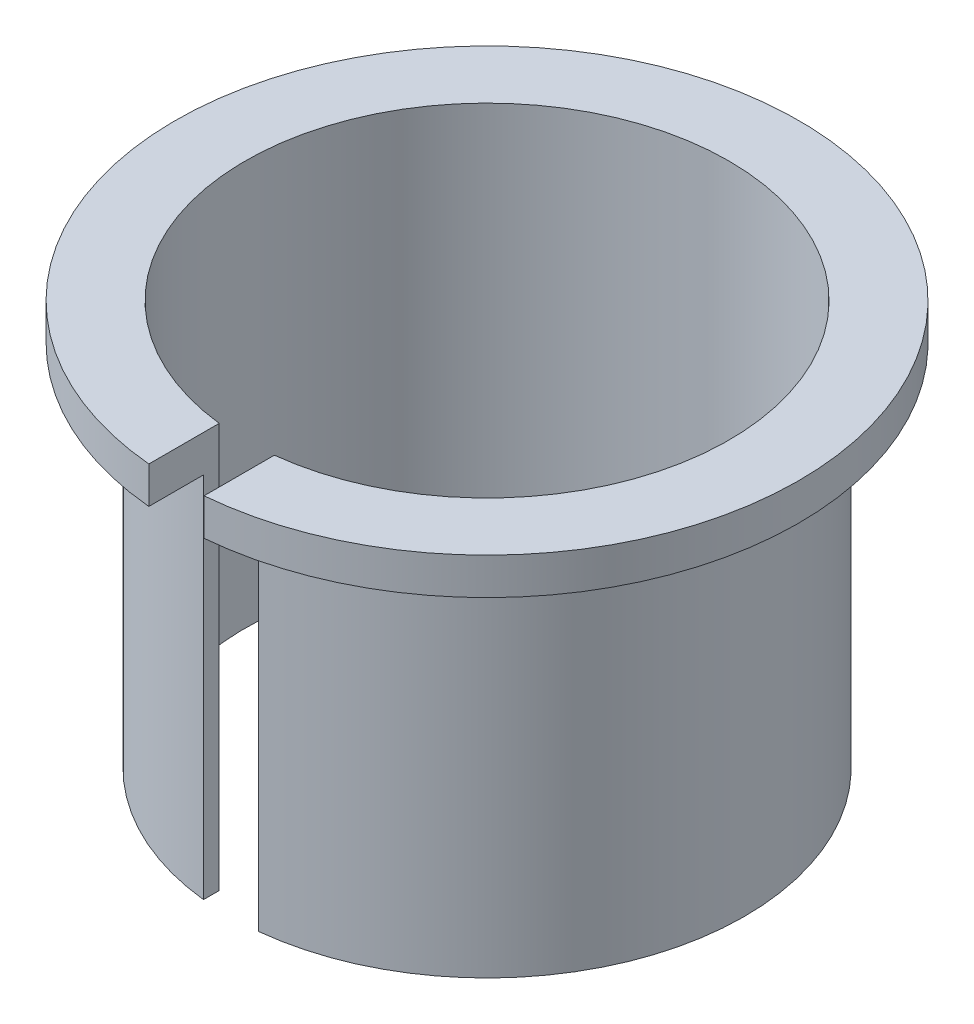
ISO-10303-21;
HEADER;
FILE_DESCRIPTION(('STEP AP214'),'2;1');
FILE_NAME('part.step','',(''),(''),'','','');
FILE_SCHEMA(('AUTOMOTIVE_DESIGN { 1 0 10303 214 1 1 1 1 }'));
ENDSEC;
DATA;
#1=APPLICATION_CONTEXT('core data for automotive mechanical design processes');
#2=APPLICATION_PROTOCOL_DEFINITION('international standard','automotive_design',2000,#1);
#3=PRODUCT_CONTEXT('',#1,'mechanical');
#4=PRODUCT('Part','Part','',(#3));
#5=PRODUCT_RELATED_PRODUCT_CATEGORY('part','',(#4));
#6=PRODUCT_DEFINITION_FORMATION('','',#4);
#7=PRODUCT_DEFINITION_CONTEXT('part definition',#1,'design');
#8=PRODUCT_DEFINITION('design','',#6,#7);
#9=PRODUCT_DEFINITION_SHAPE('','',#8);
#10=(LENGTH_UNIT() NAMED_UNIT(*) SI_UNIT(.MILLI.,.METRE.));
#11=(NAMED_UNIT(*) PLANE_ANGLE_UNIT() SI_UNIT($,.RADIAN.));
#12=(NAMED_UNIT(*) SI_UNIT($,.STERADIAN.) SOLID_ANGLE_UNIT());
#13=UNCERTAINTY_MEASURE_WITH_UNIT(LENGTH_MEASURE(1.E-05),#10,'distance_accuracy_value','');
#14=(GEOMETRIC_REPRESENTATION_CONTEXT(3) GLOBAL_UNCERTAINTY_ASSIGNED_CONTEXT((#13)) GLOBAL_UNIT_ASSIGNED_CONTEXT((#10,
#11,#12)) REPRESENTATION_CONTEXT('',''));
#15=CARTESIAN_POINT('',(0.,0.,0.));
#16=DIRECTION('',(0.,0.,1.));
#17=DIRECTION('',(1.,0.,0.));
#18=AXIS2_PLACEMENT_3D('',#15,#16,#17);
#19=CARTESIAN_POINT('',(0.,20.,0.));
#20=DIRECTION('',(0.,-1.,0.));
#21=DIRECTION('',(0.,0.,-1.));
#22=AXIS2_PLACEMENT_3D('',#19,#20,#21);
#23=CYLINDRICAL_SURFACE('',#22,13.15);
#24=CARTESIAN_POINT('',(0.,0.,0.));
#25=DIRECTION('',(0.,1.,0.));
#26=DIRECTION('',(0.,0.,1.));
#27=AXIS2_PLACEMENT_3D('',#24,#25,#26);
#28=CIRCLE('',#27,13.15);
#29=CARTESIAN_POINT('',(1.5,0.,13.0641685537197));
#30=VERTEX_POINT('',#29);
#31=CARTESIAN_POINT('',(-1.5,0.,13.0641685537197));
#32=VERTEX_POINT('',#31);
#33=EDGE_CURVE('E90',#30,#32,#28,.T.);
#34=ORIENTED_EDGE('',*,*,#33,.F.);
#35=DIRECTION('',(0.,-1.,0.));
#36=VECTOR('',#35,1.);
#37=CARTESIAN_POINT('',(1.5,20.,13.0641685537197));
#38=LINE('',#37,#36);
#39=CARTESIAN_POINT('',(1.5,22.,13.0641685537197));
#40=VERTEX_POINT('',#39);
#41=EDGE_CURVE('E11',#40,#30,#38,.T.);
#42=ORIENTED_EDGE('',*,*,#41,.F.);
#43=CARTESIAN_POINT('',(0.,22.,0.));
#44=DIRECTION('',(0.,-1.,0.));
#45=DIRECTION('',(0.,0.,1.));
#46=AXIS2_PLACEMENT_3D('',#43,#44,#45);
#47=CIRCLE('',#46,13.15);
#48=CARTESIAN_POINT('',(-1.5,22.,13.0641685537197));
#49=VERTEX_POINT('',#48);
#50=EDGE_CURVE('E114',#49,#40,#47,.T.);
#51=ORIENTED_EDGE('',*,*,#50,.F.);
#52=DIRECTION('',(0.,-1.,0.));
#53=VECTOR('',#52,1.);
#54=CARTESIAN_POINT('',(-1.5,20.,13.0641685537197));
#55=LINE('',#54,#53);
#56=EDGE_CURVE('E78',#49,#32,#55,.T.);
#57=ORIENTED_EDGE('',*,*,#56,.T.);
#58=EDGE_LOOP('',(#34,#42,#51,#57));
#59=FACE_BOUND('',#58,.T.);
#60=ADVANCED_FACE('F35',(#59),#23,.F.);
#61=CARTESIAN_POINT('',(1.49999999999999,20.,0.));
#62=DIRECTION('',(1.,0.,0.));
#63=DIRECTION('',(0.,0.,-1.));
#64=AXIS2_PLACEMENT_3D('',#61,#62,#63);
#65=PLANE('',#64);
#66=DIRECTION('',(0.,0.,1.));
#67=VECTOR('',#66,1.);
#68=CARTESIAN_POINT('',(1.49999999999999,0.,0.));
#69=LINE('',#68,#67);
#70=CARTESIAN_POINT('',(1.5,0.,13.9194109070751));
#71=VERTEX_POINT('',#70);
#72=EDGE_CURVE('E85',#30,#71,#69,.T.);
#73=ORIENTED_EDGE('',*,*,#72,.T.);
#74=DIRECTION('',(0.,-1.,0.));
#75=VECTOR('',#74,1.);
#76=CARTESIAN_POINT('',(1.5,20.,13.9194109070751));
#77=LINE('',#76,#75);
#78=CARTESIAN_POINT('',(1.5,20.,13.9194109070751));
#79=VERTEX_POINT('',#78);
#80=EDGE_CURVE('E44',#79,#71,#77,.T.);
#81=ORIENTED_EDGE('',*,*,#80,.F.);
#82=DIRECTION('',(0.,0.,1.));
#83=VECTOR('',#82,1.);
#84=CARTESIAN_POINT('',(1.5,20.,13.0641685537197));
#85=LINE('',#84,#83);
#86=CARTESIAN_POINT('',(1.5,20.,16.8883915820893));
#87=VERTEX_POINT('',#86);
#88=EDGE_CURVE('E102',#79,#87,#85,.T.);
#89=ORIENTED_EDGE('',*,*,#88,.T.);
#90=DIRECTION('',(0.,-1.,0.));
#91=VECTOR('',#90,1.);
#92=CARTESIAN_POINT('',(1.5,22.,16.8883915820893));
#93=LINE('',#92,#91);
#94=CARTESIAN_POINT('',(1.5,22.,16.8883915820893));
#95=VERTEX_POINT('',#94);
#96=EDGE_CURVE('E105',#95,#87,#93,.T.);
#97=ORIENTED_EDGE('',*,*,#96,.F.);
#98=DIRECTION('',(0.,0.,1.));
#99=VECTOR('',#98,1.);
#100=CARTESIAN_POINT('',(1.5,22.,13.0641685537197));
#101=LINE('',#100,#99);
#102=EDGE_CURVE('E130',#40,#95,#101,.T.);
#103=ORIENTED_EDGE('',*,*,#102,.F.);
#104=ORIENTED_EDGE('',*,*,#41,.T.);
#105=EDGE_LOOP('',(#73,#81,#89,#97,#103,#104));
#106=FACE_BOUND('',#105,.T.);
#107=ADVANCED_FACE('F106',(#106),#65,.F.);
#108=CARTESIAN_POINT('',(0.,20.,0.));
#109=DIRECTION('',(0.,-1.,0.));
#110=DIRECTION('',(0.,0.,-1.));
#111=AXIS2_PLACEMENT_3D('',#108,#109,#110);
#112=CYLINDRICAL_SURFACE('',#111,14.);
#113=CARTESIAN_POINT('',(0.,0.,0.));
#114=DIRECTION('',(0.,1.,0.));
#115=DIRECTION('',(0.,0.,1.));
#116=AXIS2_PLACEMENT_3D('',#113,#114,#115);
#117=CIRCLE('',#116,14.);
#118=CARTESIAN_POINT('',(-1.5,0.,13.9194109070751));
#119=VERTEX_POINT('',#118);
#120=EDGE_CURVE('E81',#71,#119,#117,.T.);
#121=ORIENTED_EDGE('',*,*,#120,.T.);
#122=DIRECTION('',(0.,-1.,0.));
#123=VECTOR('',#122,1.);
#124=CARTESIAN_POINT('',(-1.5,20.,13.9194109070751));
#125=LINE('',#124,#123);
#126=CARTESIAN_POINT('',(-1.5,20.,13.9194109070751));
#127=VERTEX_POINT('',#126);
#128=EDGE_CURVE('E67',#127,#119,#125,.T.);
#129=ORIENTED_EDGE('',*,*,#128,.F.);
#130=CARTESIAN_POINT('',(0.,20.,0.));
#131=DIRECTION('',(0.,1.,0.));
#132=DIRECTION('',(0.,0.,1.));
#133=AXIS2_PLACEMENT_3D('',#130,#131,#132);
#134=CIRCLE('',#133,14.);
#135=EDGE_CURVE('E91',#79,#127,#134,.T.);
#136=ORIENTED_EDGE('',*,*,#135,.F.);
#137=ORIENTED_EDGE('',*,*,#80,.T.);
#138=EDGE_LOOP('',(#121,#129,#136,#137));
#139=FACE_BOUND('',#138,.T.);
#140=ADVANCED_FACE('F82',(#139),#112,.T.);
#141=CARTESIAN_POINT('',(-1.49999999999999,20.,0.));
#142=DIRECTION('',(1.,0.,0.));
#143=DIRECTION('',(0.,0.,-1.));
#144=AXIS2_PLACEMENT_3D('',#141,#142,#143);
#145=PLANE('',#144);
#146=DIRECTION('',(0.,0.,1.));
#147=VECTOR('',#146,1.);
#148=CARTESIAN_POINT('',(-1.49999999999999,0.,0.));
#149=LINE('',#148,#147);
#150=EDGE_CURVE('E72',#32,#119,#149,.T.);
#151=ORIENTED_EDGE('',*,*,#150,.F.);
#152=ORIENTED_EDGE('',*,*,#56,.F.);
#153=DIRECTION('',(0.,0.,-1.));
#154=VECTOR('',#153,1.);
#155=CARTESIAN_POINT('',(-1.5,22.,13.0641685537197));
#156=LINE('',#155,#154);
#157=CARTESIAN_POINT('',(-1.5,22.,16.8883915820893));
#158=VERTEX_POINT('',#157);
#159=EDGE_CURVE('E118',#158,#49,#156,.T.);
#160=ORIENTED_EDGE('',*,*,#159,.F.);
#161=DIRECTION('',(0.,-1.,0.));
#162=VECTOR('',#161,1.);
#163=CARTESIAN_POINT('',(-1.5,22.,16.8883915820893));
#164=LINE('',#163,#162);
#165=CARTESIAN_POINT('',(-1.5,20.,16.8883915820893));
#166=VERTEX_POINT('',#165);
#167=EDGE_CURVE('E127',#158,#166,#164,.T.);
#168=ORIENTED_EDGE('',*,*,#167,.T.);
#169=DIRECTION('',(0.,0.,-1.));
#170=VECTOR('',#169,1.);
#171=CARTESIAN_POINT('',(-1.5,20.,13.0641685537197));
#172=LINE('',#171,#170);
#173=EDGE_CURVE('E75',#166,#127,#172,.T.);
#174=ORIENTED_EDGE('',*,*,#173,.T.);
#175=ORIENTED_EDGE('',*,*,#128,.T.);
#176=EDGE_LOOP('',(#151,#152,#160,#168,#174,#175));
#177=FACE_BOUND('',#176,.T.);
#178=ADVANCED_FACE('F69',(#177),#145,.T.);
#179=CARTESIAN_POINT('',(0.,0.,0.));
#180=DIRECTION('',(0.,1.,0.));
#181=DIRECTION('',(0.,0.,1.));
#182=AXIS2_PLACEMENT_3D('',#179,#180,#181);
#183=PLANE('',#182);
#184=ORIENTED_EDGE('',*,*,#33,.T.);
#185=ORIENTED_EDGE('',*,*,#150,.T.);
#186=ORIENTED_EDGE('',*,*,#120,.F.);
#187=ORIENTED_EDGE('',*,*,#72,.F.);
#188=EDGE_LOOP('',(#184,#185,#186,#187));
#189=FACE_BOUND('',#188,.T.);
#190=ADVANCED_FACE('F88',(#189),#183,.F.);
#191=CARTESIAN_POINT('',(0.,22.,0.));
#192=DIRECTION('',(0.,-1.,0.));
#193=DIRECTION('',(0.,0.,-1.));
#194=AXIS2_PLACEMENT_3D('',#191,#192,#193);
#195=CYLINDRICAL_SURFACE('',#194,16.9548745271083);
#196=CARTESIAN_POINT('',(0.,20.,0.));
#197=DIRECTION('',(0.,1.,0.));
#198=DIRECTION('',(0.,0.,1.));
#199=AXIS2_PLACEMENT_3D('',#196,#197,#198);
#200=CIRCLE('',#199,16.9548745271083);
#201=EDGE_CURVE('E135',#87,#166,#200,.T.);
#202=ORIENTED_EDGE('',*,*,#201,.T.);
#203=ORIENTED_EDGE('',*,*,#167,.F.);
#204=CARTESIAN_POINT('',(0.,22.,0.));
#205=DIRECTION('',(0.,1.,0.));
#206=DIRECTION('',(0.,0.,1.));
#207=AXIS2_PLACEMENT_3D('',#204,#205,#206);
#208=CIRCLE('',#207,16.9548745271083);
#209=EDGE_CURVE('E125',#95,#158,#208,.T.);
#210=ORIENTED_EDGE('',*,*,#209,.F.);
#211=ORIENTED_EDGE('',*,*,#96,.T.);
#212=EDGE_LOOP('',(#202,#203,#210,#211));
#213=FACE_BOUND('',#212,.T.);
#214=ADVANCED_FACE('F145',(#213),#195,.T.);
#215=CARTESIAN_POINT('',(0.,22.,0.));
#216=DIRECTION('',(0.,1.,0.));
#217=DIRECTION('',(0.,0.,1.));
#218=AXIS2_PLACEMENT_3D('',#215,#216,#217);
#219=PLANE('',#218);
#220=ORIENTED_EDGE('',*,*,#50,.T.);
#221=ORIENTED_EDGE('',*,*,#102,.T.);
#222=ORIENTED_EDGE('',*,*,#209,.T.);
#223=ORIENTED_EDGE('',*,*,#159,.T.);
#224=EDGE_LOOP('',(#220,#221,#222,#223));
#225=FACE_BOUND('',#224,.T.);
#226=ADVANCED_FACE('F122',(#225),#219,.T.);
#227=CARTESIAN_POINT('',(0.,20.,0.));
#228=DIRECTION('',(0.,1.,0.));
#229=DIRECTION('',(0.,0.,1.));
#230=AXIS2_PLACEMENT_3D('',#227,#228,#229);
#231=PLANE('',#230);
#232=ORIENTED_EDGE('',*,*,#88,.F.);
#233=ORIENTED_EDGE('',*,*,#135,.T.);
#234=ORIENTED_EDGE('',*,*,#173,.F.);
#235=ORIENTED_EDGE('',*,*,#201,.F.);
#236=EDGE_LOOP('',(#232,#233,#234,#235));
#237=FACE_BOUND('',#236,.T.);
#238=ADVANCED_FACE('F151',(#237),#231,.F.);
#239=CLOSED_SHELL('',(#60,#107,#140,#178,#190,#214,#226,#238));
#240=MANIFOLD_SOLID_BREP('B2',#239);
#241=ADVANCED_BREP_SHAPE_REPRESENTATION('',(#18,#240),#14);
#242=SHAPE_DEFINITION_REPRESENTATION(#9,#241);
ENDSEC;
END-ISO-10303-21;
